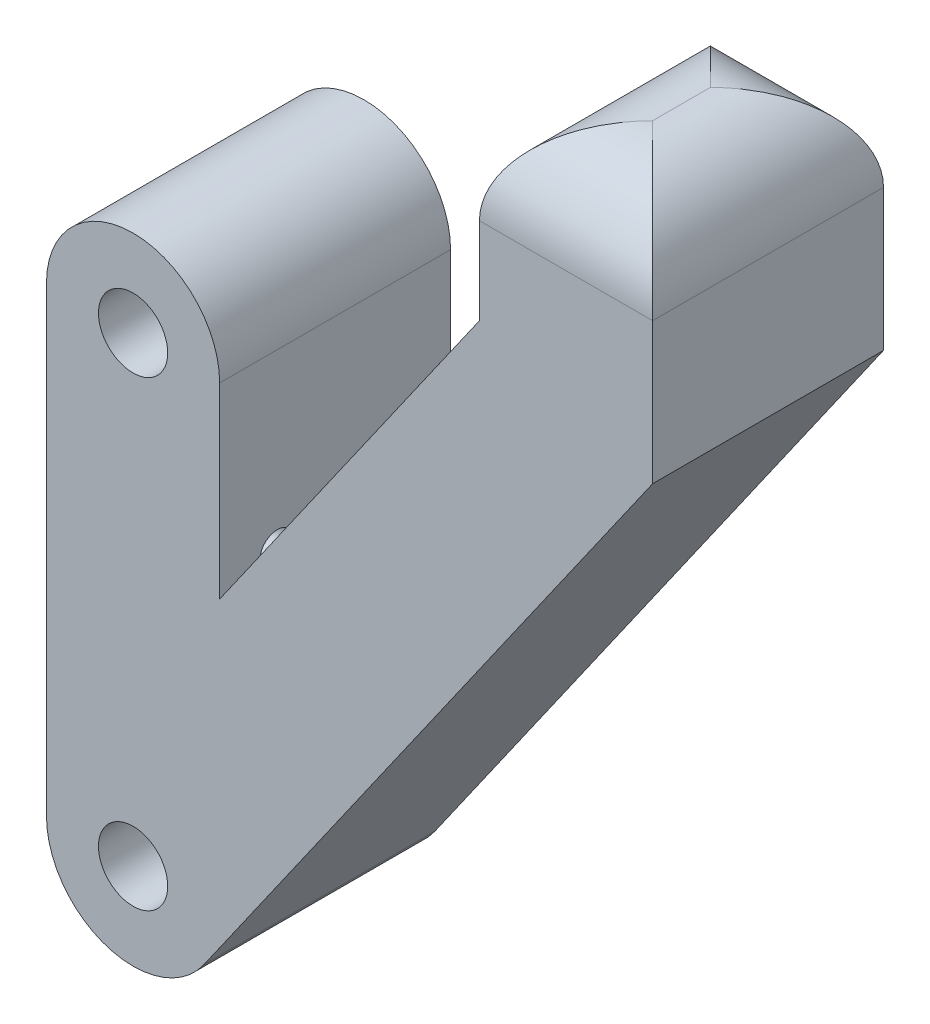
ISO-10303-21;
HEADER;
FILE_DESCRIPTION(('STEP AP214'),'2;1');
FILE_NAME('part.step','',(''),(''),'','','');
FILE_SCHEMA(('AUTOMOTIVE_DESIGN { 1 0 10303 214 1 1 1 1 }'));
ENDSEC;
DATA;
#1=APPLICATION_CONTEXT('core data for automotive mechanical design processes');
#2=APPLICATION_PROTOCOL_DEFINITION('international standard','automotive_design',2000,#1);
#3=PRODUCT_CONTEXT('',#1,'mechanical');
#4=PRODUCT('Part','Part','',(#3));
#5=PRODUCT_RELATED_PRODUCT_CATEGORY('part','',(#4));
#6=PRODUCT_DEFINITION_FORMATION('','',#4);
#7=PRODUCT_DEFINITION_CONTEXT('part definition',#1,'design');
#8=PRODUCT_DEFINITION('design','',#6,#7);
#9=PRODUCT_DEFINITION_SHAPE('','',#8);
#10=(LENGTH_UNIT() NAMED_UNIT(*) SI_UNIT(.MILLI.,.METRE.));
#11=(NAMED_UNIT(*) PLANE_ANGLE_UNIT() SI_UNIT($,.RADIAN.));
#12=(NAMED_UNIT(*) SI_UNIT($,.STERADIAN.) SOLID_ANGLE_UNIT());
#13=UNCERTAINTY_MEASURE_WITH_UNIT(LENGTH_MEASURE(1.E-05),#10,'distance_accuracy_value','');
#14=(GEOMETRIC_REPRESENTATION_CONTEXT(3) GLOBAL_UNCERTAINTY_ASSIGNED_CONTEXT((#13)) GLOBAL_UNIT_ASSIGNED_CONTEXT((#10,
#11,#12)) REPRESENTATION_CONTEXT('',''));
#15=CARTESIAN_POINT('',(0.,0.,0.));
#16=DIRECTION('',(0.,0.,1.));
#17=DIRECTION('',(1.,0.,0.));
#18=AXIS2_PLACEMENT_3D('',#15,#16,#17);
#19=CARTESIAN_POINT('',(-3.75,0.,10.));
#20=DIRECTION('',(-1.,0.,0.));
#21=DIRECTION('',(0.,0.,1.));
#22=AXIS2_PLACEMENT_3D('',#19,#20,#21);
#23=PLANE('',#22);
#24=CARTESIAN_POINT('',(-3.75,12.5,2.5));
#25=DIRECTION('',(1.,0.,0.));
#26=DIRECTION('',(0.,0.,-1.));
#27=AXIS2_PLACEMENT_3D('',#24,#25,#26);
#28=CIRCLE('',#27,0.75);
#29=CARTESIAN_POINT('',(-3.75,12.5,1.75));
#30=VERTEX_POINT('',#29);
#31=EDGE_CURVE('E205',#30,#30,#28,.T.);
#32=ORIENTED_EDGE('',*,*,#31,.T.);
#33=EDGE_LOOP('',(#32));
#34=FACE_BOUND('',#33,.T.);
#35=CARTESIAN_POINT('',(-3.75,12.5,7.5));
#36=DIRECTION('',(-1.,0.,0.));
#37=DIRECTION('',(0.,0.,1.));
#38=AXIS2_PLACEMENT_3D('',#35,#36,#37);
#39=CIRCLE('',#38,0.749999999999998);
#40=CARTESIAN_POINT('',(-3.75,12.5,8.25));
#41=VERTEX_POINT('',#40);
#42=EDGE_CURVE('E204',#41,#41,#39,.T.);
#43=ORIENTED_EDGE('',*,*,#42,.F.);
#44=EDGE_LOOP('',(#43));
#45=FACE_BOUND('',#44,.T.);
#46=CARTESIAN_POINT('',(-3.75,7.5,2.5));
#47=DIRECTION('',(-1.,0.,0.));
#48=DIRECTION('',(0.,0.,1.));
#49=AXIS2_PLACEMENT_3D('',#46,#47,#48);
#50=CIRCLE('',#49,0.75);
#51=CARTESIAN_POINT('',(-3.75,7.5,3.25));
#52=VERTEX_POINT('',#51);
#53=EDGE_CURVE('E588',#52,#52,#50,.T.);
#54=ORIENTED_EDGE('',*,*,#53,.F.);
#55=EDGE_LOOP('',(#54));
#56=FACE_BOUND('',#55,.T.);
#57=DIRECTION('',(0.,1.,0.));
#58=VECTOR('',#57,1.);
#59=CARTESIAN_POINT('',(-3.75,0.,0.));
#60=LINE('',#59,#58);
#61=CARTESIAN_POINT('',(-3.75,0.,0.));
#62=VERTEX_POINT('',#61);
#63=CARTESIAN_POINT('',(-3.75,20.,0.));
#64=VERTEX_POINT('',#63);
#65=EDGE_CURVE('E283',#62,#64,#60,.T.);
#66=ORIENTED_EDGE('',*,*,#65,.F.);
#67=DIRECTION('',(0.,0.,-1.));
#68=VECTOR('',#67,1.);
#69=CARTESIAN_POINT('',(-3.75,0.,10.));
#70=LINE('',#69,#68);
#71=CARTESIAN_POINT('',(-3.75,0.,10.));
#72=VERTEX_POINT('',#71);
#73=EDGE_CURVE('E318',#72,#62,#70,.T.);
#74=ORIENTED_EDGE('',*,*,#73,.F.);
#75=DIRECTION('',(0.,1.,0.));
#76=VECTOR('',#75,1.);
#77=CARTESIAN_POINT('',(-3.75,0.,10.));
#78=LINE('',#77,#76);
#79=CARTESIAN_POINT('',(-3.75,20.,10.));
#80=VERTEX_POINT('',#79);
#81=EDGE_CURVE('E230',#72,#80,#78,.T.);
#82=ORIENTED_EDGE('',*,*,#81,.T.);
#83=DIRECTION('',(0.,0.,-1.));
#84=VECTOR('',#83,1.);
#85=CARTESIAN_POINT('',(-3.75,20.,10.));
#86=LINE('',#85,#84);
#87=EDGE_CURVE('E242',#80,#64,#86,.T.);
#88=ORIENTED_EDGE('',*,*,#87,.T.);
#89=EDGE_LOOP('',(#66,#74,#82,#88));
#90=FACE_BOUND('',#89,.T.);
#91=CARTESIAN_POINT('',(-3.75,7.5,7.5));
#92=DIRECTION('',(1.,0.,0.));
#93=DIRECTION('',(0.,0.,-1.));
#94=AXIS2_PLACEMENT_3D('',#91,#92,#93);
#95=CIRCLE('',#94,0.749999999999999);
#96=CARTESIAN_POINT('',(-3.75,7.5,6.75));
#97=VERTEX_POINT('',#96);
#98=EDGE_CURVE('E592',#97,#97,#95,.T.);
#99=ORIENTED_EDGE('',*,*,#98,.T.);
#100=EDGE_LOOP('',(#99));
#101=FACE_BOUND('',#100,.T.);
#102=ADVANCED_FACE('F107',(#34,#45,#56,#90,#101),#23,.T.);
#103=CARTESIAN_POINT('',(3.75,20.,10.));
#104=DIRECTION('',(1.,0.,0.));
#105=DIRECTION('',(0.,0.,-1.));
#106=AXIS2_PLACEMENT_3D('',#103,#104,#105);
#107=PLANE('',#106);
#108=DIRECTION('',(0.,0.,-1.));
#109=VECTOR('',#108,1.);
#110=CARTESIAN_POINT('',(3.75,11.8934805088622,10.));
#111=LINE('',#110,#109);
#112=CARTESIAN_POINT('',(3.75,11.8934805088622,7.05882644359629));
#113=VERTEX_POINT('',#112);
#114=CARTESIAN_POINT('',(3.75,11.8934805088622,2.94117355640371));
#115=VERTEX_POINT('',#114);
#116=EDGE_CURVE('E214',#113,#115,#111,.T.);
#117=ORIENTED_EDGE('',*,*,#116,.T.);
#118=CARTESIAN_POINT('',(3.75,12.5,2.5));
#119=DIRECTION('',(1.,0.,0.));
#120=DIRECTION('',(0.,0.,-1.));
#121=AXIS2_PLACEMENT_3D('',#118,#119,#120);
#122=CIRCLE('',#121,0.75);
#123=CARTESIAN_POINT('',(3.75,11.8934805088622,2.05882644359629));
#124=VERTEX_POINT('',#123);
#125=EDGE_CURVE('E12',#115,#124,#122,.F.);
#126=ORIENTED_EDGE('',*,*,#125,.T.);
#127=CARTESIAN_POINT('',(3.75,11.8934805088622,0.));
#128=VERTEX_POINT('',#127);
#129=EDGE_CURVE('E221',#124,#128,#111,.T.);
#130=ORIENTED_EDGE('',*,*,#129,.T.);
#131=DIRECTION('',(0.,-1.,0.));
#132=VECTOR('',#131,1.);
#133=CARTESIAN_POINT('',(3.75,20.,0.));
#134=LINE('',#133,#132);
#135=CARTESIAN_POINT('',(3.75,20.,0.));
#136=VERTEX_POINT('',#135);
#137=EDGE_CURVE('E298',#136,#128,#134,.T.);
#138=ORIENTED_EDGE('',*,*,#137,.F.);
#139=DIRECTION('',(0.,0.,-1.));
#140=VECTOR('',#139,1.);
#141=CARTESIAN_POINT('',(3.75,20.,10.));
#142=LINE('',#141,#140);
#143=CARTESIAN_POINT('',(3.75,20.,10.));
#144=VERTEX_POINT('',#143);
#145=EDGE_CURVE('E227',#144,#136,#142,.T.);
#146=ORIENTED_EDGE('',*,*,#145,.F.);
#147=DIRECTION('',(0.,-1.,0.));
#148=VECTOR('',#147,1.);
#149=CARTESIAN_POINT('',(3.75,20.,10.));
#150=LINE('',#149,#148);
#151=CARTESIAN_POINT('',(3.75,11.8934805088622,10.));
#152=VERTEX_POINT('',#151);
#153=EDGE_CURVE('E219',#144,#152,#150,.T.);
#154=ORIENTED_EDGE('',*,*,#153,.T.);
#155=CARTESIAN_POINT('',(3.75,11.8934805088622,7.94117355640371));
#156=VERTEX_POINT('',#155);
#157=EDGE_CURVE('E211',#152,#156,#111,.T.);
#158=ORIENTED_EDGE('',*,*,#157,.T.);
#159=CARTESIAN_POINT('',(3.75,12.5,7.5));
#160=DIRECTION('',(1.,0.,0.));
#161=DIRECTION('',(0.,0.,-1.));
#162=AXIS2_PLACEMENT_3D('',#159,#160,#161);
#163=CIRCLE('',#162,0.749999999999998);
#164=EDGE_CURVE('E115',#113,#156,#163,.T.);
#165=ORIENTED_EDGE('',*,*,#164,.F.);
#166=EDGE_LOOP('',(#117,#126,#130,#138,#146,#154,#158,#165));
#167=FACE_BOUND('',#166,.T.);
#168=ADVANCED_FACE('F217',(#167),#107,.T.);
#169=CARTESIAN_POINT('',(0.,20.,10.));
#170=DIRECTION('',(0.,0.,-1.));
#171=DIRECTION('',(-1.,0.,0.));
#172=AXIS2_PLACEMENT_3D('',#169,#170,#171);
#173=PLANE('',#172);
#174=DIRECTION('',(0.,1.,0.));
#175=VECTOR('',#174,1.);
#176=CARTESIAN_POINT('',(22.5,25.5954046681188,10.));
#177=LINE('',#176,#175);
#178=CARTESIAN_POINT('',(22.5,25.5954046681188,10.));
#179=VERTEX_POINT('',#178);
#180=CARTESIAN_POINT('',(22.5,31.7101455847111,10.));
#181=VERTEX_POINT('',#180);
#182=EDGE_CURVE('E289',#179,#181,#177,.T.);
#183=ORIENTED_EDGE('',*,*,#182,.T.);
#184=DIRECTION('',(-1.,0.,0.));
#185=VECTOR('',#184,1.);
#186=CARTESIAN_POINT('',(0.,31.7101455847111,10.));
#187=LINE('',#186,#185);
#188=CARTESIAN_POINT('',(15.,31.7101455847111,10.));
#189=VERTEX_POINT('',#188);
#190=EDGE_CURVE('E199',#181,#189,#187,.T.);
#191=ORIENTED_EDGE('',*,*,#190,.T.);
#192=DIRECTION('',(0.,-1.,0.));
#193=VECTOR('',#192,1.);
#194=CARTESIAN_POINT('',(15.,35.4601455847111,10.));
#195=LINE('',#194,#193);
#196=CARTESIAN_POINT('',(15.,27.9601455847112,10.));
#197=VERTEX_POINT('',#196);
#198=EDGE_CURVE('E287',#189,#197,#195,.T.);
#199=ORIENTED_EDGE('',*,*,#198,.T.);
#200=DIRECTION('',(0.573576436351041,0.819152044288995,0.));
#201=VECTOR('',#200,1.);
#202=CARTESIAN_POINT('',(3.75,11.8934805088622,10.));
#203=LINE('',#202,#201);
#204=EDGE_CURVE('E285',#152,#197,#203,.T.);
#205=ORIENTED_EDGE('',*,*,#204,.F.);
#206=ORIENTED_EDGE('',*,*,#153,.F.);
#207=CARTESIAN_POINT('',(0.,20.,10.));
#208=DIRECTION('',(0.,0.,-1.));
#209=DIRECTION('',(-1.,0.,0.));
#210=AXIS2_PLACEMENT_3D('',#207,#208,#209);
#211=CIRCLE('',#210,3.75);
#212=EDGE_CURVE('E281',#80,#144,#211,.T.);
#213=ORIENTED_EDGE('',*,*,#212,.F.);
#214=ORIENTED_EDGE('',*,*,#81,.F.);
#215=CARTESIAN_POINT('',(0.,0.,10.));
#216=DIRECTION('',(0.,0.,1.));
#217=DIRECTION('',(1.,0.,0.));
#218=AXIS2_PLACEMENT_3D('',#215,#216,#217);
#219=CIRCLE('',#218,3.75);
#220=CARTESIAN_POINT('',(3.07182016608373,-2.1509116363164,10.));
#221=VERTEX_POINT('',#220);
#222=EDGE_CURVE('E235',#72,#221,#219,.T.);
#223=ORIENTED_EDGE('',*,*,#222,.T.);
#224=DIRECTION('',(0.573576436351041,0.819152044288995,0.));
#225=VECTOR('',#224,1.);
#226=CARTESIAN_POINT('',(21.1436403321675,23.6583223120783,10.));
#227=LINE('',#226,#225);
#228=EDGE_CURVE('E292',#221,#179,#227,.T.);
#229=ORIENTED_EDGE('',*,*,#228,.T.);
#230=EDGE_LOOP('',(#183,#191,#199,#205,#206,#213,#214,#223,#229));
#231=FACE_BOUND('',#230,.T.);
#232=CARTESIAN_POINT('',(0.,20.,10.));
#233=DIRECTION('',(0.,0.,1.));
#234=DIRECTION('',(1.,0.,0.));
#235=AXIS2_PLACEMENT_3D('',#232,#233,#234);
#236=CIRCLE('',#235,1.5);
#237=CARTESIAN_POINT('',(1.5,20.,10.));
#238=VERTEX_POINT('',#237);
#239=EDGE_CURVE('E275',#238,#238,#236,.T.);
#240=ORIENTED_EDGE('',*,*,#239,.F.);
#241=EDGE_LOOP('',(#240));
#242=FACE_BOUND('',#241,.T.);
#243=CARTESIAN_POINT('',(0.,0.,10.));
#244=DIRECTION('',(0.,0.,1.));
#245=DIRECTION('',(1.,0.,0.));
#246=AXIS2_PLACEMENT_3D('',#243,#244,#245);
#247=CIRCLE('',#246,1.5);
#248=CARTESIAN_POINT('',(1.5,0.,10.));
#249=VERTEX_POINT('',#248);
#250=EDGE_CURVE('E266',#249,#249,#247,.T.);
#251=ORIENTED_EDGE('',*,*,#250,.F.);
#252=EDGE_LOOP('',(#251));
#253=FACE_BOUND('',#252,.T.);
#254=ADVANCED_FACE('F343',(#231,#242,#253),#173,.F.);
#255=CARTESIAN_POINT('',(0.,20.,0.));
#256=DIRECTION('',(0.,0.,-1.));
#257=DIRECTION('',(-1.,0.,0.));
#258=AXIS2_PLACEMENT_3D('',#255,#256,#257);
#259=PLANE('',#258);
#260=CARTESIAN_POINT('',(0.,20.,0.));
#261=DIRECTION('',(0.,0.,1.));
#262=DIRECTION('',(1.,0.,0.));
#263=AXIS2_PLACEMENT_3D('',#260,#261,#262);
#264=CIRCLE('',#263,1.5);
#265=CARTESIAN_POINT('',(1.5,20.,0.));
#266=VERTEX_POINT('',#265);
#267=EDGE_CURVE('E271',#266,#266,#264,.T.);
#268=ORIENTED_EDGE('',*,*,#267,.T.);
#269=EDGE_LOOP('',(#268));
#270=FACE_BOUND('',#269,.T.);
#271=DIRECTION('',(0.,-1.,0.));
#272=VECTOR('',#271,1.);
#273=CARTESIAN_POINT('',(15.,35.4601455847111,0.));
#274=LINE('',#273,#272);
#275=CARTESIAN_POINT('',(15.,31.7101455847111,0.));
#276=VERTEX_POINT('',#275);
#277=CARTESIAN_POINT('',(15.,27.9601455847112,0.));
#278=VERTEX_POINT('',#277);
#279=EDGE_CURVE('E304',#276,#278,#274,.T.);
#280=ORIENTED_EDGE('',*,*,#279,.F.);
#281=DIRECTION('',(-1.,0.,0.));
#282=VECTOR('',#281,1.);
#283=CARTESIAN_POINT('',(22.5,31.7101455847111,0.));
#284=LINE('',#283,#282);
#285=CARTESIAN_POINT('',(22.5,31.7101455847111,0.));
#286=VERTEX_POINT('',#285);
#287=EDGE_CURVE('E241',#276,#286,#284,.F.);
#288=ORIENTED_EDGE('',*,*,#287,.T.);
#289=DIRECTION('',(0.,1.,0.));
#290=VECTOR('',#289,1.);
#291=CARTESIAN_POINT('',(22.5,25.5954046681188,0.));
#292=LINE('',#291,#290);
#293=CARTESIAN_POINT('',(22.5,25.5954046681188,0.));
#294=VERTEX_POINT('',#293);
#295=EDGE_CURVE('E306',#294,#286,#292,.T.);
#296=ORIENTED_EDGE('',*,*,#295,.F.);
#297=DIRECTION('',(-0.573576436351041,-0.819152044288995,0.));
#298=VECTOR('',#297,1.);
#299=CARTESIAN_POINT('',(9.89364033216746,7.59165723622935,0.));
#300=LINE('',#299,#298);
#301=CARTESIAN_POINT('',(3.07182016608373,-2.1509116363164,0.));
#302=VERTEX_POINT('',#301);
#303=EDGE_CURVE('E309',#294,#302,#300,.T.);
#304=ORIENTED_EDGE('',*,*,#303,.T.);
#305=CARTESIAN_POINT('',(0.,0.,0.));
#306=DIRECTION('',(0.,0.,1.));
#307=DIRECTION('',(1.,0.,0.));
#308=AXIS2_PLACEMENT_3D('',#305,#306,#307);
#309=CIRCLE('',#308,3.75);
#310=EDGE_CURVE('E312',#62,#302,#309,.T.);
#311=ORIENTED_EDGE('',*,*,#310,.F.);
#312=ORIENTED_EDGE('',*,*,#65,.T.);
#313=CARTESIAN_POINT('',(0.,20.,0.));
#314=DIRECTION('',(0.,0.,-1.));
#315=DIRECTION('',(-1.,0.,0.));
#316=AXIS2_PLACEMENT_3D('',#313,#314,#315);
#317=CIRCLE('',#316,3.75);
#318=EDGE_CURVE('E278',#64,#136,#317,.T.);
#319=ORIENTED_EDGE('',*,*,#318,.T.);
#320=ORIENTED_EDGE('',*,*,#137,.T.);
#321=DIRECTION('',(0.573576436351041,0.819152044288995,0.));
#322=VECTOR('',#321,1.);
#323=CARTESIAN_POINT('',(3.75,11.8934805088622,0.));
#324=LINE('',#323,#322);
#325=EDGE_CURVE('E301',#128,#278,#324,.T.);
#326=ORIENTED_EDGE('',*,*,#325,.T.);
#327=EDGE_LOOP('',(#280,#288,#296,#304,#311,#312,#319,#320,#326));
#328=FACE_BOUND('',#327,.T.);
#329=CARTESIAN_POINT('',(0.,0.,0.));
#330=DIRECTION('',(0.,0.,1.));
#331=DIRECTION('',(1.,0.,0.));
#332=AXIS2_PLACEMENT_3D('',#329,#330,#331);
#333=CIRCLE('',#332,1.5);
#334=CARTESIAN_POINT('',(1.5,0.,0.));
#335=VERTEX_POINT('',#334);
#336=EDGE_CURVE('E259',#335,#335,#333,.T.);
#337=ORIENTED_EDGE('',*,*,#336,.T.);
#338=EDGE_LOOP('',(#337));
#339=FACE_BOUND('',#338,.T.);
#340=ADVANCED_FACE('F332',(#270,#328,#339),#259,.T.);
#341=CARTESIAN_POINT('',(0.,20.,10.));
#342=DIRECTION('',(0.,0.,-1.));
#343=DIRECTION('',(-1.,0.,0.));
#344=AXIS2_PLACEMENT_3D('',#341,#342,#343);
#345=CYLINDRICAL_SURFACE('',#344,3.75);
#346=ORIENTED_EDGE('',*,*,#318,.F.);
#347=ORIENTED_EDGE('',*,*,#87,.F.);
#348=ORIENTED_EDGE('',*,*,#212,.T.);
#349=ORIENTED_EDGE('',*,*,#145,.T.);
#350=EDGE_LOOP('',(#346,#347,#348,#349));
#351=FACE_BOUND('',#350,.T.);
#352=ADVANCED_FACE('F356',(#351),#345,.T.);
#353=CARTESIAN_POINT('',(0.,0.,10.));
#354=DIRECTION('',(0.,0.,-1.));
#355=DIRECTION('',(-1.,0.,0.));
#356=AXIS2_PLACEMENT_3D('',#353,#354,#355);
#357=CYLINDRICAL_SURFACE('',#356,3.75);
#358=ORIENTED_EDGE('',*,*,#310,.T.);
#359=DIRECTION('',(0.,0.,-1.));
#360=VECTOR('',#359,1.);
#361=CARTESIAN_POINT('',(3.07182016608373,-2.1509116363164,10.));
#362=LINE('',#361,#360);
#363=EDGE_CURVE('E320',#221,#302,#362,.T.);
#364=ORIENTED_EDGE('',*,*,#363,.F.);
#365=ORIENTED_EDGE('',*,*,#222,.F.);
#366=ORIENTED_EDGE('',*,*,#73,.T.);
#367=EDGE_LOOP('',(#358,#364,#365,#366));
#368=FACE_BOUND('',#367,.T.);
#369=ADVANCED_FACE('F351',(#368),#357,.T.);
#370=CARTESIAN_POINT('',(9.89364033216746,7.59165723622935,10.));
#371=DIRECTION('',(0.819152044288995,-0.573576436351041,0.));
#372=DIRECTION('',(0.573576436351041,0.819152044288995,0.));
#373=AXIS2_PLACEMENT_3D('',#370,#371,#372);
#374=PLANE('',#373);
#375=ORIENTED_EDGE('',*,*,#303,.F.);
#376=DIRECTION('',(0.,0.,-1.));
#377=VECTOR('',#376,1.);
#378=CARTESIAN_POINT('',(22.5,25.5954046681188,10.));
#379=LINE('',#378,#377);
#380=EDGE_CURVE('E223',#179,#294,#379,.T.);
#381=ORIENTED_EDGE('',*,*,#380,.F.);
#382=ORIENTED_EDGE('',*,*,#228,.F.);
#383=ORIENTED_EDGE('',*,*,#363,.T.);
#384=EDGE_LOOP('',(#375,#381,#382,#383));
#385=FACE_BOUND('',#384,.T.);
#386=ADVANCED_FACE('F349',(#385),#374,.T.);
#387=CARTESIAN_POINT('',(22.5,25.5954046681188,10.));
#388=DIRECTION('',(-1.,0.,0.));
#389=DIRECTION('',(0.,-1.,0.));
#390=AXIS2_PLACEMENT_3D('',#387,#388,#389);
#391=PLANE('',#390);
#392=ORIENTED_EDGE('',*,*,#295,.T.);
#393=DIRECTION('',(0.,0.,-1.));
#394=VECTOR('',#393,1.);
#395=CARTESIAN_POINT('',(22.5,31.7101455847112,10.));
#396=LINE('',#395,#394);
#397=EDGE_CURVE('E238',#286,#181,#396,.F.);
#398=ORIENTED_EDGE('',*,*,#397,.T.);
#399=ORIENTED_EDGE('',*,*,#182,.F.);
#400=ORIENTED_EDGE('',*,*,#380,.T.);
#401=EDGE_LOOP('',(#392,#398,#399,#400));
#402=FACE_BOUND('',#401,.T.);
#403=ADVANCED_FACE('F327',(#402),#391,.F.);
#404=CARTESIAN_POINT('',(15.,35.4601455847111,10.));
#405=DIRECTION('',(1.,0.,0.));
#406=DIRECTION('',(0.,1.,0.));
#407=AXIS2_PLACEMENT_3D('',#404,#405,#406);
#408=PLANE('',#407);
#409=ORIENTED_EDGE('',*,*,#198,.F.);
#410=DIRECTION('',(0.,0.,-1.));
#411=VECTOR('',#410,1.);
#412=CARTESIAN_POINT('',(15.,31.7101455847111,10.));
#413=LINE('',#412,#411);
#414=EDGE_CURVE('E244',#189,#276,#413,.T.);
#415=ORIENTED_EDGE('',*,*,#414,.T.);
#416=ORIENTED_EDGE('',*,*,#279,.T.);
#417=DIRECTION('',(0.,0.,-1.));
#418=VECTOR('',#417,1.);
#419=CARTESIAN_POINT('',(15.,27.9601455847112,10.));
#420=LINE('',#419,#418);
#421=EDGE_CURVE('E220',#197,#278,#420,.T.);
#422=ORIENTED_EDGE('',*,*,#421,.F.);
#423=EDGE_LOOP('',(#409,#415,#416,#422));
#424=FACE_BOUND('',#423,.T.);
#425=ADVANCED_FACE('F359',(#424),#408,.F.);
#426=CARTESIAN_POINT('',(3.75,11.8934805088622,10.));
#427=DIRECTION('',(-0.819152044288995,0.573576436351041,0.));
#428=DIRECTION('',(-0.573576436351041,-0.819152044288995,0.));
#429=AXIS2_PLACEMENT_3D('',#426,#427,#428);
#430=PLANE('',#429);
#431=ORIENTED_EDGE('',*,*,#325,.F.);
#432=ORIENTED_EDGE('',*,*,#129,.F.);
#433=EDGE_CURVE('E226',#115,#124,#111,.T.);
#434=ORIENTED_EDGE('',*,*,#433,.F.);
#435=ORIENTED_EDGE('',*,*,#116,.F.);
#436=EDGE_CURVE('E203',#156,#113,#111,.T.);
#437=ORIENTED_EDGE('',*,*,#436,.F.);
#438=ORIENTED_EDGE('',*,*,#157,.F.);
#439=ORIENTED_EDGE('',*,*,#204,.T.);
#440=ORIENTED_EDGE('',*,*,#421,.T.);
#441=EDGE_LOOP('',(#431,#432,#434,#435,#437,#438,#439,#440));
#442=FACE_BOUND('',#441,.T.);
#443=ADVANCED_FACE('F209',(#442),#430,.T.);
#444=CARTESIAN_POINT('',(0.,20.,10.));
#445=DIRECTION('',(0.,0.,-1.));
#446=DIRECTION('',(-1.,0.,0.));
#447=AXIS2_PLACEMENT_3D('',#444,#445,#446);
#448=CYLINDRICAL_SURFACE('',#447,1.5);
#449=ORIENTED_EDGE('',*,*,#239,.T.);
#450=EDGE_LOOP('',(#449));
#451=FACE_BOUND('',#450,.T.);
#452=ORIENTED_EDGE('',*,*,#267,.F.);
#453=EDGE_LOOP('',(#452));
#454=FACE_BOUND('',#453,.T.);
#455=ADVANCED_FACE('F390',(#451,#454),#448,.F.);
#456=CARTESIAN_POINT('',(0.,0.,10.));
#457=DIRECTION('',(0.,0.,-1.));
#458=DIRECTION('',(-1.,0.,0.));
#459=AXIS2_PLACEMENT_3D('',#456,#457,#458);
#460=CYLINDRICAL_SURFACE('',#459,1.5);
#461=ORIENTED_EDGE('',*,*,#250,.T.);
#462=EDGE_LOOP('',(#461));
#463=FACE_BOUND('',#462,.T.);
#464=ORIENTED_EDGE('',*,*,#336,.F.);
#465=EDGE_LOOP('',(#464));
#466=FACE_BOUND('',#465,.T.);
#467=ADVANCED_FACE('F367',(#463,#466),#460,.F.);
#468=CARTESIAN_POINT('',(0.,31.7101455847111,6.25));
#469=DIRECTION('',(-1.,0.,0.));
#470=DIRECTION('',(0.,0.,1.));
#471=AXIS2_PLACEMENT_3D('',#468,#469,#470);
#472=CYLINDRICAL_SURFACE('',#471,3.75);
#473=CARTESIAN_POINT('',(18.75,31.7101455847111,6.25));
#474=DIRECTION('',(-0.707106781186547,0.,-0.707106781186547));
#475=DIRECTION('',(-0.707106781186547,0.,0.707106781186547));
#476=AXIS2_PLACEMENT_3D('',#473,#474,#475);
#477=ELLIPSE('',#476,5.30330085889911,3.75);
#478=CARTESIAN_POINT('',(18.75,35.4601455847111,6.25));
#479=VERTEX_POINT('',#478);
#480=EDGE_CURVE('E258',#189,#479,#477,.T.);
#481=ORIENTED_EDGE('',*,*,#480,.F.);
#482=ORIENTED_EDGE('',*,*,#190,.F.);
#483=CARTESIAN_POINT('',(18.75,31.7101455847111,6.25));
#484=DIRECTION('',(-0.707106781186547,0.,0.707106781186547));
#485=DIRECTION('',(-0.707106781186547,0.,-0.707106781186547));
#486=AXIS2_PLACEMENT_3D('',#483,#484,#485);
#487=ELLIPSE('',#486,5.30330085889911,3.75);
#488=EDGE_CURVE('E254',#479,#181,#487,.F.);
#489=ORIENTED_EDGE('',*,*,#488,.F.);
#490=EDGE_LOOP('',(#481,#482,#489));
#491=FACE_BOUND('',#490,.T.);
#492=ADVANCED_FACE('F109',(#491),#472,.T.);
#493=CARTESIAN_POINT('',(18.75,31.7101455847111,10.));
#494=DIRECTION('',(0.,0.,-1.));
#495=DIRECTION('',(-1.,0.,0.));
#496=AXIS2_PLACEMENT_3D('',#493,#494,#495);
#497=CYLINDRICAL_SURFACE('',#496,3.75);
#498=CARTESIAN_POINT('',(18.75,31.7101455847111,3.75));
#499=DIRECTION('',(0.707106781186547,0.,-0.707106781186547));
#500=DIRECTION('',(-0.707106781186547,0.,-0.707106781186547));
#501=AXIS2_PLACEMENT_3D('',#498,#499,#500);
#502=ELLIPSE('',#501,5.30330085889911,3.75);
#503=CARTESIAN_POINT('',(18.75,35.4601455847111,3.75));
#504=VERTEX_POINT('',#503);
#505=EDGE_CURVE('E256',#276,#504,#502,.T.);
#506=ORIENTED_EDGE('',*,*,#505,.F.);
#507=ORIENTED_EDGE('',*,*,#414,.F.);
#508=ORIENTED_EDGE('',*,*,#480,.T.);
#509=DIRECTION('',(0.,0.,-1.));
#510=VECTOR('',#509,1.);
#511=CARTESIAN_POINT('',(18.75,35.4601455847111,10.));
#512=LINE('',#511,#510);
#513=EDGE_CURVE('E250',#504,#479,#512,.F.);
#514=ORIENTED_EDGE('',*,*,#513,.F.);
#515=EDGE_LOOP('',(#506,#507,#508,#514));
#516=FACE_BOUND('',#515,.T.);
#517=ADVANCED_FACE('F360',(#516),#497,.T.);
#518=CARTESIAN_POINT('',(22.5,31.7101455847111,3.75));
#519=DIRECTION('',(1.,0.,0.));
#520=DIRECTION('',(0.,0.,-1.));
#521=AXIS2_PLACEMENT_3D('',#518,#519,#520);
#522=CYLINDRICAL_SURFACE('',#521,3.75);
#523=ORIENTED_EDGE('',*,*,#287,.F.);
#524=ORIENTED_EDGE('',*,*,#505,.T.);
#525=CARTESIAN_POINT('',(18.75,31.7101455847111,3.75));
#526=DIRECTION('',(0.707106781186547,0.,0.707106781186547));
#527=DIRECTION('',(0.707106781186547,0.,-0.707106781186547));
#528=AXIS2_PLACEMENT_3D('',#525,#526,#527);
#529=ELLIPSE('',#528,5.30330085889911,3.75);
#530=EDGE_CURVE('E247',#286,#504,#529,.T.);
#531=ORIENTED_EDGE('',*,*,#530,.F.);
#532=EDGE_LOOP('',(#523,#524,#531));
#533=FACE_BOUND('',#532,.T.);
#534=ADVANCED_FACE('F338',(#533),#522,.T.);
#535=CARTESIAN_POINT('',(18.75,31.7101455847111,10.));
#536=DIRECTION('',(0.,0.,-1.));
#537=DIRECTION('',(-1.,0.,0.));
#538=AXIS2_PLACEMENT_3D('',#535,#536,#537);
#539=CYLINDRICAL_SURFACE('',#538,3.75);
#540=ORIENTED_EDGE('',*,*,#488,.T.);
#541=ORIENTED_EDGE('',*,*,#397,.F.);
#542=ORIENTED_EDGE('',*,*,#530,.T.);
#543=ORIENTED_EDGE('',*,*,#513,.T.);
#544=EDGE_LOOP('',(#540,#541,#542,#543));
#545=FACE_BOUND('',#544,.T.);
#546=ADVANCED_FACE('F340',(#545),#539,.T.);
#547=CARTESIAN_POINT('',(3.75,20.,10.));
#548=DIRECTION('',(1.,0.,0.));
#549=DIRECTION('',(0.,0.,-1.));
#550=AXIS2_PLACEMENT_3D('',#547,#548,#549);
#551=PLANE('',#550);
#552=ORIENTED_EDGE('',*,*,#436,.T.);
#553=CARTESIAN_POINT('',(3.75,12.5,7.5));
#554=DIRECTION('',(1.,0.,0.));
#555=DIRECTION('',(0.,0.,-1.));
#556=AXIS2_PLACEMENT_3D('',#553,#554,#555);
#557=CIRCLE('',#556,0.749999999999998);
#558=EDGE_CURVE('E128',#113,#156,#557,.F.);
#559=ORIENTED_EDGE('',*,*,#558,.T.);
#560=EDGE_LOOP('',(#552,#559));
#561=FACE_BOUND('',#560,.T.);
#562=ADVANCED_FACE('F202',(#561),#551,.F.);
#563=CARTESIAN_POINT('',(5.87132034355964,12.5,7.5));
#564=DIRECTION('',(-1.,0.,0.));
#565=DIRECTION('',(0.,0.,1.));
#566=AXIS2_PLACEMENT_3D('',#563,#564,#565);
#567=CYLINDRICAL_SURFACE('',#566,0.749999999999998);
#568=ORIENTED_EDGE('',*,*,#42,.T.);
#569=EDGE_LOOP('',(#568));
#570=FACE_BOUND('',#569,.T.);
#571=ORIENTED_EDGE('',*,*,#558,.F.);
#572=ORIENTED_EDGE('',*,*,#164,.T.);
#573=EDGE_LOOP('',(#571,#572));
#574=FACE_BOUND('',#573,.T.);
#575=ADVANCED_FACE('F194',(#570,#574),#567,.F.);
#576=CARTESIAN_POINT('',(5.87132034355964,12.5,2.5));
#577=DIRECTION('',(-1.,0.,0.));
#578=DIRECTION('',(0.,0.,1.));
#579=AXIS2_PLACEMENT_3D('',#576,#577,#578);
#580=CYLINDRICAL_SURFACE('',#579,0.75);
#581=ORIENTED_EDGE('',*,*,#31,.F.);
#582=EDGE_LOOP('',(#581));
#583=FACE_BOUND('',#582,.T.);
#584=CARTESIAN_POINT('',(3.75,12.5,2.5));
#585=DIRECTION('',(1.,0.,0.));
#586=DIRECTION('',(0.,0.,-1.));
#587=AXIS2_PLACEMENT_3D('',#584,#585,#586);
#588=CIRCLE('',#587,0.75);
#589=EDGE_CURVE('E121',#115,#124,#588,.T.);
#590=ORIENTED_EDGE('',*,*,#589,.T.);
#591=ORIENTED_EDGE('',*,*,#125,.F.);
#592=EDGE_LOOP('',(#590,#591));
#593=FACE_BOUND('',#592,.T.);
#594=ADVANCED_FACE('F402',(#583,#593),#580,.F.);
#595=CARTESIAN_POINT('',(3.75,20.,10.));
#596=DIRECTION('',(1.,0.,0.));
#597=DIRECTION('',(0.,0.,-1.));
#598=AXIS2_PLACEMENT_3D('',#595,#596,#597);
#599=PLANE('',#598);
#600=ORIENTED_EDGE('',*,*,#433,.T.);
#601=ORIENTED_EDGE('',*,*,#589,.F.);
#602=EDGE_LOOP('',(#600,#601));
#603=FACE_BOUND('',#602,.T.);
#604=ADVANCED_FACE('F406',(#603),#599,.F.);
#605=CARTESIAN_POINT('',(3.75,20.,10.));
#606=DIRECTION('',(1.,0.,0.));
#607=DIRECTION('',(0.,0.,-1.));
#608=AXIS2_PLACEMENT_3D('',#605,#606,#607);
#609=PLANE('',#608);
#610=CARTESIAN_POINT('',(3.75,7.5,2.5));
#611=DIRECTION('',(1.,0.,0.));
#612=DIRECTION('',(0.,0.,-1.));
#613=AXIS2_PLACEMENT_3D('',#610,#611,#612);
#614=CIRCLE('',#613,0.75);
#615=CARTESIAN_POINT('',(3.75,7.5,1.75));
#616=VERTEX_POINT('',#615);
#617=EDGE_CURVE('E251',#616,#616,#614,.F.);
#618=ORIENTED_EDGE('',*,*,#617,.T.);
#619=EDGE_LOOP('',(#618));
#620=FACE_BOUND('',#619,.T.);
#621=ADVANCED_FACE('F409',(#620),#609,.F.);
#622=CARTESIAN_POINT('',(5.87132034355964,7.5,2.5));
#623=DIRECTION('',(-1.,0.,0.));
#624=DIRECTION('',(0.,0.,1.));
#625=AXIS2_PLACEMENT_3D('',#622,#623,#624);
#626=CYLINDRICAL_SURFACE('',#625,0.75);
#627=ORIENTED_EDGE('',*,*,#53,.T.);
#628=EDGE_LOOP('',(#627));
#629=FACE_BOUND('',#628,.T.);
#630=ORIENTED_EDGE('',*,*,#617,.F.);
#631=EDGE_LOOP('',(#630));
#632=FACE_BOUND('',#631,.T.);
#633=ADVANCED_FACE('F421',(#629,#632),#626,.F.);
#634=CARTESIAN_POINT('',(5.87132034355964,7.5,7.5));
#635=DIRECTION('',(-1.,0.,0.));
#636=DIRECTION('',(0.,0.,1.));
#637=AXIS2_PLACEMENT_3D('',#634,#635,#636);
#638=CYLINDRICAL_SURFACE('',#637,0.749999999999999);
#639=ORIENTED_EDGE('',*,*,#98,.F.);
#640=EDGE_LOOP('',(#639));
#641=FACE_BOUND('',#640,.T.);
#642=CARTESIAN_POINT('',(3.75,7.5,7.5));
#643=DIRECTION('',(1.,0.,0.));
#644=DIRECTION('',(0.,0.,-1.));
#645=AXIS2_PLACEMENT_3D('',#642,#643,#644);
#646=CIRCLE('',#645,0.749999999999999);
#647=CARTESIAN_POINT('',(3.75,7.5,6.75));
#648=VERTEX_POINT('',#647);
#649=EDGE_CURVE('E595',#648,#648,#646,.T.);
#650=ORIENTED_EDGE('',*,*,#649,.T.);
#651=EDGE_LOOP('',(#650));
#652=FACE_BOUND('',#651,.T.);
#653=ADVANCED_FACE('F417',(#641,#652),#638,.F.);
#654=CARTESIAN_POINT('',(3.75,20.,10.));
#655=DIRECTION('',(1.,0.,0.));
#656=DIRECTION('',(0.,0.,-1.));
#657=AXIS2_PLACEMENT_3D('',#654,#655,#656);
#658=PLANE('',#657);
#659=ORIENTED_EDGE('',*,*,#649,.F.);
#660=EDGE_LOOP('',(#659));
#661=FACE_BOUND('',#660,.T.);
#662=ADVANCED_FACE('F414',(#661),#658,.F.);
#663=CLOSED_SHELL('',(#102,#168,#254,#340,#352,#369,#386,#403,#425,#443,#455,#467,#492,#517,
#534,#546,#562,#575,#594,#604,#621,#633,#653,#662));
#664=MANIFOLD_SOLID_BREP('B2',#663);
#665=ADVANCED_BREP_SHAPE_REPRESENTATION('',(#18,#664),#14);
#666=SHAPE_DEFINITION_REPRESENTATION(#9,#665);
ENDSEC;
END-ISO-10303-21;
